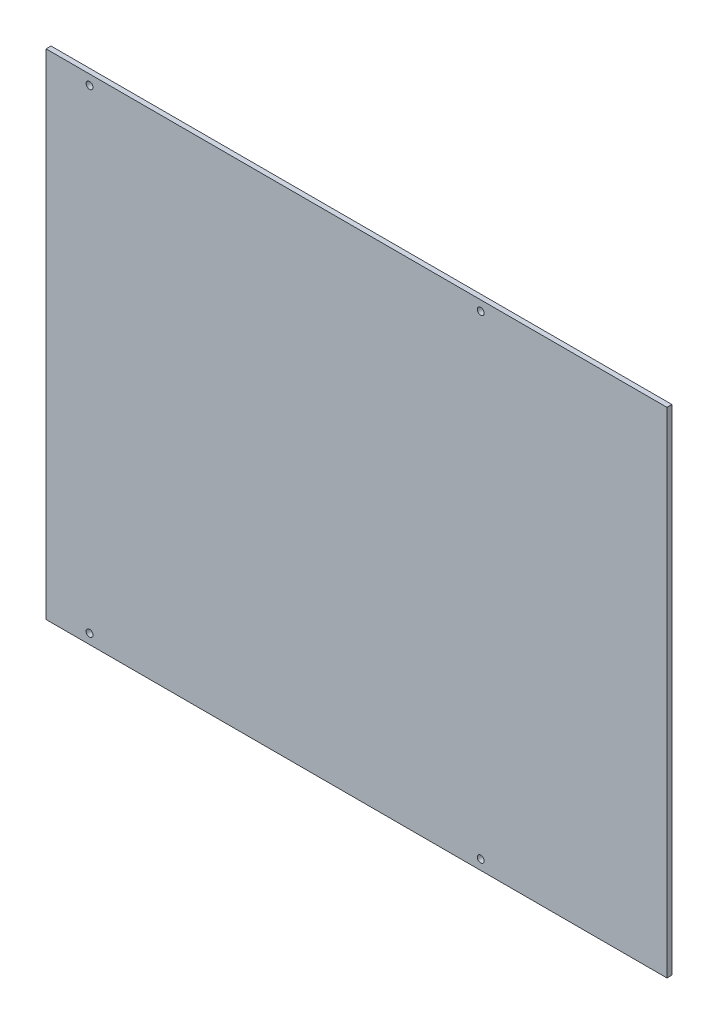
ISO-10303-21;
HEADER;
FILE_DESCRIPTION(('STEP AP214'),'2;1');
FILE_NAME('part.step','',(''),(''),'','','');
FILE_SCHEMA(('AUTOMOTIVE_DESIGN { 1 0 10303 214 1 1 1 1 }'));
ENDSEC;
DATA;
#1=APPLICATION_CONTEXT('core data for automotive mechanical design processes');
#2=APPLICATION_PROTOCOL_DEFINITION('international standard','automotive_design',2000,#1);
#3=PRODUCT_CONTEXT('',#1,'mechanical');
#4=PRODUCT('Part','Part','',(#3));
#5=PRODUCT_RELATED_PRODUCT_CATEGORY('part','',(#4));
#6=PRODUCT_DEFINITION_FORMATION('','',#4);
#7=PRODUCT_DEFINITION_CONTEXT('part definition',#1,'design');
#8=PRODUCT_DEFINITION('design','',#6,#7);
#9=PRODUCT_DEFINITION_SHAPE('','',#8);
#10=(LENGTH_UNIT() NAMED_UNIT(*) SI_UNIT(.MILLI.,.METRE.));
#11=(NAMED_UNIT(*) PLANE_ANGLE_UNIT() SI_UNIT($,.RADIAN.));
#12=(NAMED_UNIT(*) SI_UNIT($,.STERADIAN.) SOLID_ANGLE_UNIT());
#13=UNCERTAINTY_MEASURE_WITH_UNIT(LENGTH_MEASURE(1.E-05),#10,'distance_accuracy_value','');
#14=(GEOMETRIC_REPRESENTATION_CONTEXT(3) GLOBAL_UNCERTAINTY_ASSIGNED_CONTEXT((#13)) GLOBAL_UNIT_ASSIGNED_CONTEXT((#10,
#11,#12)) REPRESENTATION_CONTEXT('',''));
#15=CARTESIAN_POINT('',(0.,0.,0.));
#16=DIRECTION('',(0.,0.,1.));
#17=DIRECTION('',(1.,0.,0.));
#18=AXIS2_PLACEMENT_3D('',#15,#16,#17);
#19=CARTESIAN_POINT('',(250.,-199.,4.));
#20=DIRECTION('',(-1.,0.,0.));
#21=DIRECTION('',(0.,0.,1.));
#22=AXIS2_PLACEMENT_3D('',#19,#20,#21);
#23=PLANE('',#22);
#24=DIRECTION('',(0.,1.,0.));
#25=VECTOR('',#24,1.);
#26=CARTESIAN_POINT('',(250.,-199.,0.));
#27=LINE('',#26,#25);
#28=CARTESIAN_POINT('',(250.,-199.,0.));
#29=VERTEX_POINT('',#28);
#30=CARTESIAN_POINT('',(250.,199.,0.));
#31=VERTEX_POINT('',#30);
#32=EDGE_CURVE('E95',#29,#31,#27,.T.);
#33=ORIENTED_EDGE('',*,*,#32,.T.);
#34=DIRECTION('',(0.,0.,-1.));
#35=VECTOR('',#34,1.);
#36=CARTESIAN_POINT('',(250.,199.,4.));
#37=LINE('',#36,#35);
#38=CARTESIAN_POINT('',(250.,199.,4.));
#39=VERTEX_POINT('',#38);
#40=EDGE_CURVE('E11',#39,#31,#37,.T.);
#41=ORIENTED_EDGE('',*,*,#40,.F.);
#42=DIRECTION('',(0.,1.,0.));
#43=VECTOR('',#42,1.);
#44=CARTESIAN_POINT('',(250.,-199.,4.));
#45=LINE('',#44,#43);
#46=CARTESIAN_POINT('',(250.,-199.,4.));
#47=VERTEX_POINT('',#46);
#48=EDGE_CURVE('E83',#47,#39,#45,.T.);
#49=ORIENTED_EDGE('',*,*,#48,.F.);
#50=DIRECTION('',(0.,0.,-1.));
#51=VECTOR('',#50,1.);
#52=CARTESIAN_POINT('',(250.,-199.,4.));
#53=LINE('',#52,#51);
#54=EDGE_CURVE('E91',#47,#29,#53,.T.);
#55=ORIENTED_EDGE('',*,*,#54,.T.);
#56=EDGE_LOOP('',(#33,#41,#49,#55));
#57=FACE_BOUND('',#56,.T.);
#58=ADVANCED_FACE('F32',(#57),#23,.F.);
#59=CARTESIAN_POINT('',(-250.,199.,4.));
#60=DIRECTION('',(0.,-1.,0.));
#61=DIRECTION('',(0.,0.,-1.));
#62=AXIS2_PLACEMENT_3D('',#59,#60,#61);
#63=PLANE('',#62);
#64=DIRECTION('',(-1.,0.,0.));
#65=VECTOR('',#64,1.);
#66=CARTESIAN_POINT('',(-250.,199.,0.));
#67=LINE('',#66,#65);
#68=CARTESIAN_POINT('',(-250.,199.,0.));
#69=VERTEX_POINT('',#68);
#70=EDGE_CURVE('E87',#31,#69,#67,.T.);
#71=ORIENTED_EDGE('',*,*,#70,.T.);
#72=DIRECTION('',(0.,0.,-1.));
#73=VECTOR('',#72,1.);
#74=CARTESIAN_POINT('',(-250.,199.,4.));
#75=LINE('',#74,#73);
#76=CARTESIAN_POINT('',(-250.,199.,4.));
#77=VERTEX_POINT('',#76);
#78=EDGE_CURVE('E40',#77,#69,#75,.T.);
#79=ORIENTED_EDGE('',*,*,#78,.F.);
#80=DIRECTION('',(-1.,0.,0.));
#81=VECTOR('',#80,1.);
#82=CARTESIAN_POINT('',(-250.,199.,4.));
#83=LINE('',#82,#81);
#84=EDGE_CURVE('E78',#39,#77,#83,.T.);
#85=ORIENTED_EDGE('',*,*,#84,.F.);
#86=ORIENTED_EDGE('',*,*,#40,.T.);
#87=EDGE_LOOP('',(#71,#79,#85,#86));
#88=FACE_BOUND('',#87,.T.);
#89=ADVANCED_FACE('F86',(#88),#63,.F.);
#90=CARTESIAN_POINT('',(-250.,-199.,4.));
#91=DIRECTION('',(1.,0.,0.));
#92=DIRECTION('',(0.,0.,-1.));
#93=AXIS2_PLACEMENT_3D('',#90,#91,#92);
#94=PLANE('',#93);
#95=DIRECTION('',(0.,-1.,0.));
#96=VECTOR('',#95,1.);
#97=CARTESIAN_POINT('',(-250.,-199.,0.));
#98=LINE('',#97,#96);
#99=CARTESIAN_POINT('',(-250.,-199.,0.));
#100=VERTEX_POINT('',#99);
#101=EDGE_CURVE('E65',#69,#100,#98,.T.);
#102=ORIENTED_EDGE('',*,*,#101,.T.);
#103=DIRECTION('',(0.,0.,-1.));
#104=VECTOR('',#103,1.);
#105=CARTESIAN_POINT('',(-250.,-199.,4.));
#106=LINE('',#105,#104);
#107=CARTESIAN_POINT('',(-250.,-199.,4.));
#108=VERTEX_POINT('',#107);
#109=EDGE_CURVE('E88',#108,#100,#106,.T.);
#110=ORIENTED_EDGE('',*,*,#109,.F.);
#111=DIRECTION('',(0.,-1.,0.));
#112=VECTOR('',#111,1.);
#113=CARTESIAN_POINT('',(-250.,-199.,4.));
#114=LINE('',#113,#112);
#115=EDGE_CURVE('E81',#77,#108,#114,.T.);
#116=ORIENTED_EDGE('',*,*,#115,.F.);
#117=ORIENTED_EDGE('',*,*,#78,.T.);
#118=EDGE_LOOP('',(#102,#110,#116,#117));
#119=FACE_BOUND('',#118,.T.);
#120=ADVANCED_FACE('F89',(#119),#94,.F.);
#121=CARTESIAN_POINT('',(-250.,-199.,4.));
#122=DIRECTION('',(0.,1.,0.));
#123=DIRECTION('',(0.,0.,1.));
#124=AXIS2_PLACEMENT_3D('',#121,#122,#123);
#125=PLANE('',#124);
#126=DIRECTION('',(1.,0.,0.));
#127=VECTOR('',#126,1.);
#128=CARTESIAN_POINT('',(-250.,-199.,0.));
#129=LINE('',#128,#127);
#130=EDGE_CURVE('E71',#100,#29,#129,.T.);
#131=ORIENTED_EDGE('',*,*,#130,.T.);
#132=ORIENTED_EDGE('',*,*,#54,.F.);
#133=DIRECTION('',(1.,0.,0.));
#134=VECTOR('',#133,1.);
#135=CARTESIAN_POINT('',(-250.,-199.,4.));
#136=LINE('',#135,#134);
#137=EDGE_CURVE('E48',#108,#47,#136,.T.);
#138=ORIENTED_EDGE('',*,*,#137,.F.);
#139=ORIENTED_EDGE('',*,*,#109,.T.);
#140=EDGE_LOOP('',(#131,#132,#138,#139));
#141=FACE_BOUND('',#140,.T.);
#142=ADVANCED_FACE('F103',(#141),#125,.F.);
#143=CARTESIAN_POINT('',(0.,0.,4.));
#144=DIRECTION('',(0.,0.,-1.));
#145=DIRECTION('',(-1.,0.,0.));
#146=AXIS2_PLACEMENT_3D('',#143,#144,#145);
#147=PLANE('',#146);
#148=CARTESIAN_POINT('',(-215.,191.,4.));
#149=DIRECTION('',(0.,0.,1.));
#150=DIRECTION('',(1.,0.,0.));
#151=AXIS2_PLACEMENT_3D('',#148,#149,#150);
#152=CIRCLE('',#151,2.75);
#153=CARTESIAN_POINT('',(-212.25,191.,4.));
#154=VERTEX_POINT('',#153);
#155=EDGE_CURVE('E129',#154,#154,#152,.T.);
#156=ORIENTED_EDGE('',*,*,#155,.F.);
#157=EDGE_LOOP('',(#156));
#158=FACE_BOUND('',#157,.T.);
#159=CARTESIAN_POINT('',(100.,191.,4.));
#160=DIRECTION('',(0.,0.,1.));
#161=DIRECTION('',(1.,0.,0.));
#162=AXIS2_PLACEMENT_3D('',#159,#160,#161);
#163=CIRCLE('',#162,2.74999999999999);
#164=CARTESIAN_POINT('',(102.75,191.,4.));
#165=VERTEX_POINT('',#164);
#166=EDGE_CURVE('E123',#165,#165,#163,.T.);
#167=ORIENTED_EDGE('',*,*,#166,.F.);
#168=EDGE_LOOP('',(#167));
#169=FACE_BOUND('',#168,.T.);
#170=CARTESIAN_POINT('',(100.,-191.,4.));
#171=DIRECTION('',(0.,0.,1.));
#172=DIRECTION('',(1.,0.,0.));
#173=AXIS2_PLACEMENT_3D('',#170,#171,#172);
#174=CIRCLE('',#173,2.74999999999999);
#175=CARTESIAN_POINT('',(102.75,-191.,4.));
#176=VERTEX_POINT('',#175);
#177=EDGE_CURVE('E117',#176,#176,#174,.T.);
#178=ORIENTED_EDGE('',*,*,#177,.F.);
#179=EDGE_LOOP('',(#178));
#180=FACE_BOUND('',#179,.T.);
#181=CARTESIAN_POINT('',(-215.,-191.,4.));
#182=DIRECTION('',(0.,0.,1.));
#183=DIRECTION('',(1.,0.,0.));
#184=AXIS2_PLACEMENT_3D('',#181,#182,#183);
#185=CIRCLE('',#184,2.75);
#186=CARTESIAN_POINT('',(-212.25,-191.,4.));
#187=VERTEX_POINT('',#186);
#188=EDGE_CURVE('E111',#187,#187,#185,.T.);
#189=ORIENTED_EDGE('',*,*,#188,.F.);
#190=EDGE_LOOP('',(#189));
#191=FACE_BOUND('',#190,.T.);
#192=ORIENTED_EDGE('',*,*,#48,.T.);
#193=ORIENTED_EDGE('',*,*,#84,.T.);
#194=ORIENTED_EDGE('',*,*,#115,.T.);
#195=ORIENTED_EDGE('',*,*,#137,.T.);
#196=EDGE_LOOP('',(#192,#193,#194,#195));
#197=FACE_BOUND('',#196,.T.);
#198=ADVANCED_FACE('F79',(#158,#169,#180,#191,#197),#147,.F.);
#199=CARTESIAN_POINT('',(0.,0.,0.));
#200=DIRECTION('',(0.,0.,-1.));
#201=DIRECTION('',(-1.,0.,0.));
#202=AXIS2_PLACEMENT_3D('',#199,#200,#201);
#203=PLANE('',#202);
#204=CARTESIAN_POINT('',(-215.,191.,0.));
#205=DIRECTION('',(0.,0.,1.));
#206=DIRECTION('',(1.,0.,0.));
#207=AXIS2_PLACEMENT_3D('',#204,#205,#206);
#208=CIRCLE('',#207,2.75);
#209=CARTESIAN_POINT('',(-212.25,191.,0.));
#210=VERTEX_POINT('',#209);
#211=EDGE_CURVE('E126',#210,#210,#208,.T.);
#212=ORIENTED_EDGE('',*,*,#211,.T.);
#213=EDGE_LOOP('',(#212));
#214=FACE_BOUND('',#213,.T.);
#215=CARTESIAN_POINT('',(100.,191.,0.));
#216=DIRECTION('',(0.,0.,1.));
#217=DIRECTION('',(1.,0.,0.));
#218=AXIS2_PLACEMENT_3D('',#215,#216,#217);
#219=CIRCLE('',#218,2.75);
#220=CARTESIAN_POINT('',(102.75,191.,0.));
#221=VERTEX_POINT('',#220);
#222=EDGE_CURVE('E120',#221,#221,#219,.T.);
#223=ORIENTED_EDGE('',*,*,#222,.T.);
#224=EDGE_LOOP('',(#223));
#225=FACE_BOUND('',#224,.T.);
#226=CARTESIAN_POINT('',(100.,-191.,0.));
#227=DIRECTION('',(0.,0.,1.));
#228=DIRECTION('',(1.,0.,0.));
#229=AXIS2_PLACEMENT_3D('',#226,#227,#228);
#230=CIRCLE('',#229,2.75);
#231=CARTESIAN_POINT('',(102.75,-191.,0.));
#232=VERTEX_POINT('',#231);
#233=EDGE_CURVE('E114',#232,#232,#230,.T.);
#234=ORIENTED_EDGE('',*,*,#233,.T.);
#235=EDGE_LOOP('',(#234));
#236=FACE_BOUND('',#235,.T.);
#237=CARTESIAN_POINT('',(-215.,-191.,0.));
#238=DIRECTION('',(0.,0.,1.));
#239=DIRECTION('',(1.,0.,0.));
#240=AXIS2_PLACEMENT_3D('',#237,#238,#239);
#241=CIRCLE('',#240,2.75);
#242=CARTESIAN_POINT('',(-212.25,-191.,0.));
#243=VERTEX_POINT('',#242);
#244=EDGE_CURVE('E98',#243,#243,#241,.T.);
#245=ORIENTED_EDGE('',*,*,#244,.T.);
#246=EDGE_LOOP('',(#245));
#247=FACE_BOUND('',#246,.T.);
#248=ORIENTED_EDGE('',*,*,#32,.F.);
#249=ORIENTED_EDGE('',*,*,#130,.F.);
#250=ORIENTED_EDGE('',*,*,#101,.F.);
#251=ORIENTED_EDGE('',*,*,#70,.F.);
#252=EDGE_LOOP('',(#248,#249,#250,#251));
#253=FACE_BOUND('',#252,.T.);
#254=ADVANCED_FACE('F106',(#214,#225,#236,#247,#253),#203,.T.);
#255=CARTESIAN_POINT('',(-215.,-191.,4.));
#256=DIRECTION('',(0.,0.,1.));
#257=DIRECTION('',(1.,0.,0.));
#258=AXIS2_PLACEMENT_3D('',#255,#256,#257);
#259=CYLINDRICAL_SURFACE('',#258,2.75);
#260=ORIENTED_EDGE('',*,*,#244,.F.);
#261=EDGE_LOOP('',(#260));
#262=FACE_BOUND('',#261,.T.);
#263=ORIENTED_EDGE('',*,*,#188,.T.);
#264=EDGE_LOOP('',(#263));
#265=FACE_BOUND('',#264,.T.);
#266=ADVANCED_FACE('F144',(#262,#265),#259,.F.);
#267=CARTESIAN_POINT('',(100.,-191.,4.));
#268=DIRECTION('',(0.,0.,1.));
#269=DIRECTION('',(1.,0.,0.));
#270=AXIS2_PLACEMENT_3D('',#267,#268,#269);
#271=CYLINDRICAL_SURFACE('',#270,2.75);
#272=ORIENTED_EDGE('',*,*,#233,.F.);
#273=EDGE_LOOP('',(#272));
#274=FACE_BOUND('',#273,.T.);
#275=ORIENTED_EDGE('',*,*,#177,.T.);
#276=EDGE_LOOP('',(#275));
#277=FACE_BOUND('',#276,.T.);
#278=ADVANCED_FACE('F146',(#274,#277),#271,.F.);
#279=CARTESIAN_POINT('',(100.,191.,4.));
#280=DIRECTION('',(0.,0.,1.));
#281=DIRECTION('',(1.,0.,0.));
#282=AXIS2_PLACEMENT_3D('',#279,#280,#281);
#283=CYLINDRICAL_SURFACE('',#282,2.75);
#284=ORIENTED_EDGE('',*,*,#222,.F.);
#285=EDGE_LOOP('',(#284));
#286=FACE_BOUND('',#285,.T.);
#287=ORIENTED_EDGE('',*,*,#166,.T.);
#288=EDGE_LOOP('',(#287));
#289=FACE_BOUND('',#288,.T.);
#290=ADVANCED_FACE('F153',(#286,#289),#283,.F.);
#291=CARTESIAN_POINT('',(-215.,191.,4.));
#292=DIRECTION('',(0.,0.,1.));
#293=DIRECTION('',(1.,0.,0.));
#294=AXIS2_PLACEMENT_3D('',#291,#292,#293);
#295=CYLINDRICAL_SURFACE('',#294,2.75);
#296=ORIENTED_EDGE('',*,*,#211,.F.);
#297=EDGE_LOOP('',(#296));
#298=FACE_BOUND('',#297,.T.);
#299=ORIENTED_EDGE('',*,*,#155,.T.);
#300=EDGE_LOOP('',(#299));
#301=FACE_BOUND('',#300,.T.);
#302=ADVANCED_FACE('F133',(#298,#301),#295,.F.);
#303=CLOSED_SHELL('',(#58,#89,#120,#142,#198,#254,#266,#278,#290,#302));
#304=MANIFOLD_SOLID_BREP('B2',#303);
#305=ADVANCED_BREP_SHAPE_REPRESENTATION('',(#18,#304),#14);
#306=SHAPE_DEFINITION_REPRESENTATION(#9,#305);
ENDSEC;
END-ISO-10303-21;
